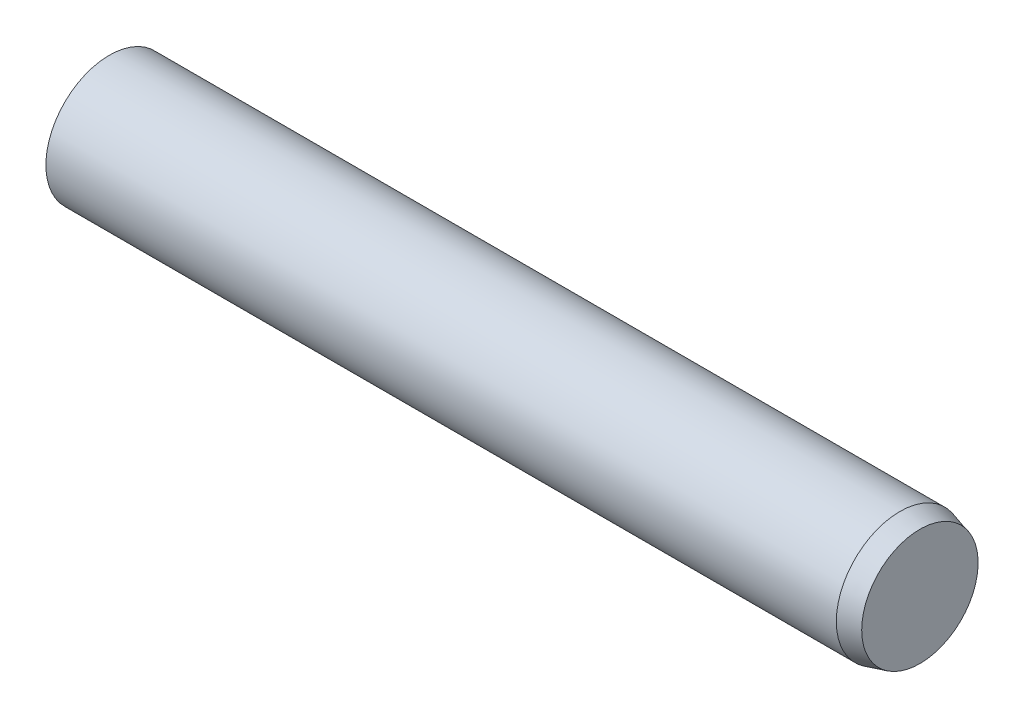
ISO-10303-21;
HEADER;
FILE_DESCRIPTION(('STEP AP214'),'2;1');
FILE_NAME('part.step','',(''),(''),'','','');
FILE_SCHEMA(('AUTOMOTIVE_DESIGN { 1 0 10303 214 1 1 1 1 }'));
ENDSEC;
DATA;
#1=APPLICATION_CONTEXT('core data for automotive mechanical design processes');
#2=APPLICATION_PROTOCOL_DEFINITION('international standard','automotive_design',2000,#1);
#3=PRODUCT_CONTEXT('',#1,'mechanical');
#4=PRODUCT('Part','Part','',(#3));
#5=PRODUCT_RELATED_PRODUCT_CATEGORY('part','',(#4));
#6=PRODUCT_DEFINITION_FORMATION('','',#4);
#7=PRODUCT_DEFINITION_CONTEXT('part definition',#1,'design');
#8=PRODUCT_DEFINITION('design','',#6,#7);
#9=PRODUCT_DEFINITION_SHAPE('','',#8);
#10=(LENGTH_UNIT() NAMED_UNIT(*) SI_UNIT(.MILLI.,.METRE.));
#11=(NAMED_UNIT(*) PLANE_ANGLE_UNIT() SI_UNIT($,.RADIAN.));
#12=(NAMED_UNIT(*) SI_UNIT($,.STERADIAN.) SOLID_ANGLE_UNIT());
#13=UNCERTAINTY_MEASURE_WITH_UNIT(LENGTH_MEASURE(1.E-05),#10,'distance_accuracy_value','');
#14=(GEOMETRIC_REPRESENTATION_CONTEXT(3) GLOBAL_UNCERTAINTY_ASSIGNED_CONTEXT((#13)) GLOBAL_UNIT_ASSIGNED_CONTEXT((#10,
#11,#12)) REPRESENTATION_CONTEXT('',''));
#15=CARTESIAN_POINT('',(0.,0.,0.));
#16=DIRECTION('',(0.,0.,1.));
#17=DIRECTION('',(1.,0.,0.));
#18=AXIS2_PLACEMENT_3D('',#15,#16,#17);
#19=CARTESIAN_POINT('',(26.,0.,0.));
#20=DIRECTION('',(1.,0.,0.));
#21=DIRECTION('',(0.,0.,-1.));
#22=AXIS2_PLACEMENT_3D('',#19,#20,#21);
#23=PLANE('',#22);
#24=CARTESIAN_POINT('',(25.9999999999536,0.,0.));
#25=DIRECTION('',(-1.,0.,0.));
#26=DIRECTION('',(0.,0.,1.));
#27=AXIS2_PLACEMENT_3D('',#24,#25,#26);
#28=CIRCLE('',#27,1.83119200877968);
#29=CARTESIAN_POINT('',(25.9999999999536,0.,1.83119200877968));
#30=VERTEX_POINT('',#29);
#31=EDGE_CURVE('E37',#30,#30,#28,.T.);
#32=ORIENTED_EDGE('',*,*,#31,.F.);
#33=EDGE_LOOP('',(#32));
#34=FACE_BOUND('',#33,.T.);
#35=ADVANCED_FACE('F34',(#34),#23,.T.);
#36=CARTESIAN_POINT('',(25.3700000001231,0.,0.));
#37=DIRECTION('',(-1.,0.,0.));
#38=DIRECTION('',(0.,0.,1.));
#39=AXIS2_PLACEMENT_3D('',#36,#37,#38);
#40=CONICAL_SURFACE('',#39,1.99999999995271,0.261799387779658);
#41=CARTESIAN_POINT('',(25.37,0.,0.));
#42=DIRECTION('',(1.,0.,0.));
#43=DIRECTION('',(0.,0.,-1.));
#44=AXIS2_PLACEMENT_3D('',#41,#42,#43);
#45=CIRCLE('',#44,2.);
#46=CARTESIAN_POINT('',(25.37,0.,-2.));
#47=VERTEX_POINT('',#46);
#48=EDGE_CURVE('E42',#47,#47,#45,.F.);
#49=ORIENTED_EDGE('',*,*,#48,.F.);
#50=EDGE_LOOP('',(#49));
#51=FACE_BOUND('',#50,.T.);
#52=ORIENTED_EDGE('',*,*,#31,.T.);
#53=EDGE_LOOP('',(#52));
#54=FACE_BOUND('',#53,.T.);
#55=ADVANCED_FACE('F50',(#51,#54),#40,.T.);
#56=CARTESIAN_POINT('',(4.24994122181607,0.,-1.46945430100631E-05));
#57=DIRECTION('',(0.,-1.,0.));
#58=DIRECTION('',(0.,0.,-1.));
#59=AXIS2_PLACEMENT_3D('',#56,#57,#58);
#60=CIRCLE('',#59,4.24994122181607);
#61=TRIMMED_CURVE('',#60,(PARAMETER_VALUE(-1.57079978438225)),
(PARAMETER_VALUE(1.57079978438225)),.T.,.PARAMETER.);
#62=CARTESIAN_POINT('',(4.24994122181607,0.,0.));
#63=DIRECTION('',(1.,0.,0.));
#64=AXIS1_PLACEMENT('',#62,#63);
#65=SURFACE_OF_REVOLUTION('',#61,#64);
#66=CARTESIAN_POINT('',(2.54041579439424E-11,0.,0.));
#67=VERTEX_POINT('',#66);
#68=VERTEX_LOOP('',#67);
#69=FACE_BOUND('',#68,.T.);
#70=CARTESIAN_POINT('',(0.500000000030377,0.,0.));
#71=DIRECTION('',(1.,0.,0.));
#72=DIRECTION('',(0.,0.,-1.));
#73=AXIS2_PLACEMENT_3D('',#70,#71,#72);
#74=CIRCLE('',#73,2.);
#75=CARTESIAN_POINT('',(0.500000000030377,0.,-2.));
#76=VERTEX_POINT('',#75);
#77=EDGE_CURVE('E11',#76,#76,#74,.T.);
#78=ORIENTED_EDGE('',*,*,#77,.F.);
#79=EDGE_LOOP('',(#78));
#80=FACE_BOUND('',#79,.T.);
#81=ADVANCED_FACE('F46',(#69,#80),#65,.T.);
#82=CARTESIAN_POINT('',(0.,0.,0.));
#83=DIRECTION('',(1.,0.,0.));
#84=DIRECTION('',(0.,0.,-1.));
#85=AXIS2_PLACEMENT_3D('',#82,#83,#84);
#86=CYLINDRICAL_SURFACE('',#85,2.);
#87=ORIENTED_EDGE('',*,*,#77,.T.);
#88=EDGE_LOOP('',(#87));
#89=FACE_BOUND('',#88,.T.);
#90=ORIENTED_EDGE('',*,*,#48,.T.);
#91=EDGE_LOOP('',(#90));
#92=FACE_BOUND('',#91,.T.);
#93=ADVANCED_FACE('F49',(#89,#92),#86,.T.);
#94=CLOSED_SHELL('',(#35,#55,#81,#93));
#95=MANIFOLD_SOLID_BREP('B2',#94);
#96=ADVANCED_BREP_SHAPE_REPRESENTATION('',(#18,#95),#14);
#97=SHAPE_DEFINITION_REPRESENTATION(#9,#96);
ENDSEC;
END-ISO-10303-21;
